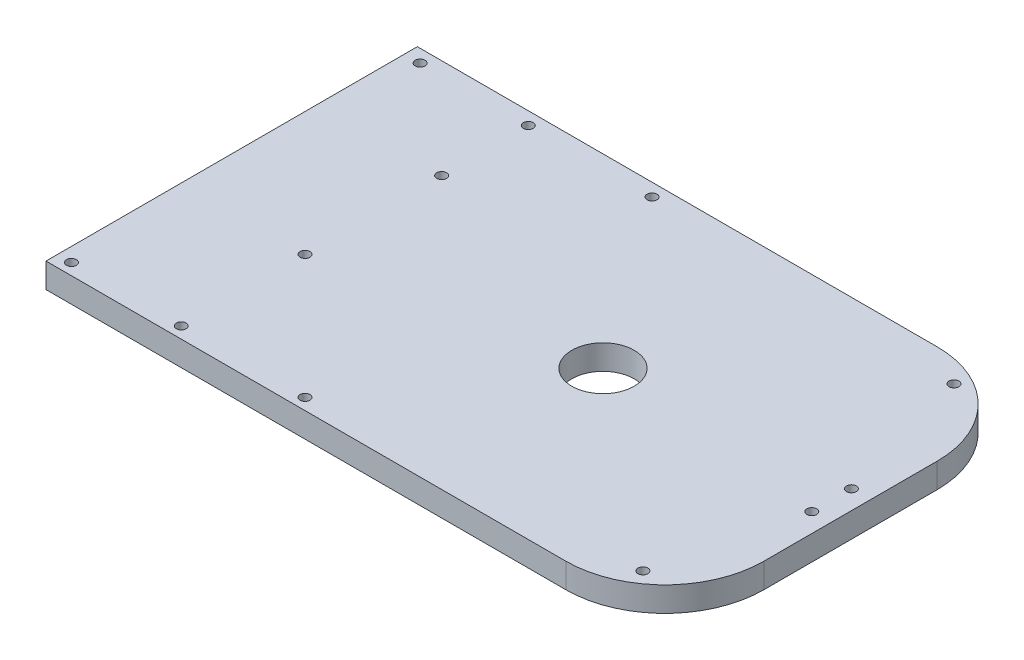
ISO-10303-21;
HEADER;
FILE_DESCRIPTION(('STEP AP214'),'2;1');
FILE_NAME('part.step','',(''),(''),'','','');
FILE_SCHEMA(('AUTOMOTIVE_DESIGN { 1 0 10303 214 1 1 1 1 }'));
ENDSEC;
DATA;
#1=APPLICATION_CONTEXT('core data for automotive mechanical design processes');
#2=APPLICATION_PROTOCOL_DEFINITION('international standard','automotive_design',2000,#1);
#3=PRODUCT_CONTEXT('',#1,'mechanical');
#4=PRODUCT('Part','Part','',(#3));
#5=PRODUCT_RELATED_PRODUCT_CATEGORY('part','',(#4));
#6=PRODUCT_DEFINITION_FORMATION('','',#4);
#7=PRODUCT_DEFINITION_CONTEXT('part definition',#1,'design');
#8=PRODUCT_DEFINITION('design','',#6,#7);
#9=PRODUCT_DEFINITION_SHAPE('','',#8);
#10=(LENGTH_UNIT() NAMED_UNIT(*) SI_UNIT(.MILLI.,.METRE.));
#11=(NAMED_UNIT(*) PLANE_ANGLE_UNIT() SI_UNIT($,.RADIAN.));
#12=(NAMED_UNIT(*) SI_UNIT($,.STERADIAN.) SOLID_ANGLE_UNIT());
#13=UNCERTAINTY_MEASURE_WITH_UNIT(LENGTH_MEASURE(1.E-05),#10,'distance_accuracy_value','');
#14=(GEOMETRIC_REPRESENTATION_CONTEXT(3) GLOBAL_UNCERTAINTY_ASSIGNED_CONTEXT((#13)) GLOBAL_UNIT_ASSIGNED_CONTEXT((#10,
#11,#12)) REPRESENTATION_CONTEXT('',''));
#15=CARTESIAN_POINT('',(0.,0.,0.));
#16=DIRECTION('',(0.,0.,1.));
#17=DIRECTION('',(1.,0.,0.));
#18=AXIS2_PLACEMENT_3D('',#15,#16,#17);
#19=CARTESIAN_POINT('',(0.,10.,0.));
#20=DIRECTION('',(1.,0.,0.));
#21=DIRECTION('',(0.,0.,-1.));
#22=AXIS2_PLACEMENT_3D('',#19,#20,#21);
#23=PLANE('',#22);
#24=DIRECTION('',(0.,0.,1.));
#25=VECTOR('',#24,1.);
#26=CARTESIAN_POINT('',(0.,0.,0.));
#27=LINE('',#26,#25);
#28=CARTESIAN_POINT('',(0.,0.,-150.));
#29=VERTEX_POINT('',#28);
#30=CARTESIAN_POINT('',(0.,0.,0.));
#31=VERTEX_POINT('',#30);
#32=EDGE_CURVE('E133',#29,#31,#27,.T.);
#33=ORIENTED_EDGE('',*,*,#32,.T.);
#34=DIRECTION('',(0.,-1.,0.));
#35=VECTOR('',#34,1.);
#36=CARTESIAN_POINT('',(0.,10.,0.));
#37=LINE('',#36,#35);
#38=CARTESIAN_POINT('',(0.,10.,0.));
#39=VERTEX_POINT('',#38);
#40=EDGE_CURVE('E11',#39,#31,#37,.T.);
#41=ORIENTED_EDGE('',*,*,#40,.F.);
#42=DIRECTION('',(0.,0.,1.));
#43=VECTOR('',#42,1.);
#44=CARTESIAN_POINT('',(0.,10.,0.));
#45=LINE('',#44,#43);
#46=CARTESIAN_POINT('',(0.,10.,-150.));
#47=VERTEX_POINT('',#46);
#48=EDGE_CURVE('E150',#47,#39,#45,.T.);
#49=ORIENTED_EDGE('',*,*,#48,.F.);
#50=DIRECTION('',(0.,-1.,0.));
#51=VECTOR('',#50,1.);
#52=CARTESIAN_POINT('',(0.,10.,-150.));
#53=LINE('',#52,#51);
#54=EDGE_CURVE('E129',#47,#29,#53,.T.);
#55=ORIENTED_EDGE('',*,*,#54,.T.);
#56=EDGE_LOOP('',(#33,#41,#49,#55));
#57=FACE_BOUND('',#56,.T.);
#58=ADVANCED_FACE('F44',(#57),#23,.F.);
#59=CARTESIAN_POINT('',(0.,10.,0.));
#60=DIRECTION('',(0.,0.,-1.));
#61=DIRECTION('',(-1.,0.,0.));
#62=AXIS2_PLACEMENT_3D('',#59,#60,#61);
#63=PLANE('',#62);
#64=DIRECTION('',(1.,0.,0.));
#65=VECTOR('',#64,1.);
#66=CARTESIAN_POINT('',(0.,0.,0.));
#67=LINE('',#66,#65);
#68=CARTESIAN_POINT('',(210.,0.,0.));
#69=VERTEX_POINT('',#68);
#70=EDGE_CURVE('E137',#31,#69,#67,.T.);
#71=ORIENTED_EDGE('',*,*,#70,.T.);
#72=DIRECTION('',(0.,-1.,0.));
#73=VECTOR('',#72,1.);
#74=CARTESIAN_POINT('',(210.,10.,0.));
#75=LINE('',#74,#73);
#76=CARTESIAN_POINT('',(210.,10.,0.));
#77=VERTEX_POINT('',#76);
#78=EDGE_CURVE('E53',#77,#69,#75,.T.);
#79=ORIENTED_EDGE('',*,*,#78,.F.);
#80=DIRECTION('',(1.,0.,0.));
#81=VECTOR('',#80,1.);
#82=CARTESIAN_POINT('',(0.,10.,0.));
#83=LINE('',#82,#81);
#84=EDGE_CURVE('E98',#39,#77,#83,.T.);
#85=ORIENTED_EDGE('',*,*,#84,.F.);
#86=ORIENTED_EDGE('',*,*,#40,.T.);
#87=EDGE_LOOP('',(#71,#79,#85,#86));
#88=FACE_BOUND('',#87,.T.);
#89=ADVANCED_FACE('F180',(#88),#63,.F.);
#90=CARTESIAN_POINT('',(210.,10.,-40.));
#91=DIRECTION('',(0.,-1.,0.));
#92=DIRECTION('',(0.,0.,-1.));
#93=AXIS2_PLACEMENT_3D('',#90,#91,#92);
#94=CYLINDRICAL_SURFACE('',#93,40.);
#95=CARTESIAN_POINT('',(210.,0.,-40.));
#96=DIRECTION('',(0.,1.,0.));
#97=DIRECTION('',(0.,0.,1.));
#98=AXIS2_PLACEMENT_3D('',#95,#96,#97);
#99=CIRCLE('',#98,40.);
#100=CARTESIAN_POINT('',(250.,0.,-40.0000000000003));
#101=VERTEX_POINT('',#100);
#102=EDGE_CURVE('E141',#69,#101,#99,.T.);
#103=ORIENTED_EDGE('',*,*,#102,.T.);
#104=DIRECTION('',(0.,-1.,0.));
#105=VECTOR('',#104,1.);
#106=CARTESIAN_POINT('',(250.,10.,-40.0000000000003));
#107=LINE('',#106,#105);
#108=CARTESIAN_POINT('',(250.,10.,-40.0000000000003));
#109=VERTEX_POINT('',#108);
#110=EDGE_CURVE('E122',#109,#101,#107,.T.);
#111=ORIENTED_EDGE('',*,*,#110,.F.);
#112=CARTESIAN_POINT('',(210.,10.,-40.));
#113=DIRECTION('',(0.,1.,0.));
#114=DIRECTION('',(0.,0.,1.));
#115=AXIS2_PLACEMENT_3D('',#112,#113,#114);
#116=CIRCLE('',#115,40.);
#117=EDGE_CURVE('E111',#77,#109,#116,.T.);
#118=ORIENTED_EDGE('',*,*,#117,.F.);
#119=ORIENTED_EDGE('',*,*,#78,.T.);
#120=EDGE_LOOP('',(#103,#111,#118,#119));
#121=FACE_BOUND('',#120,.T.);
#122=ADVANCED_FACE('F160',(#121),#94,.T.);
#123=CARTESIAN_POINT('',(250.,10.,-40.0000000000003));
#124=DIRECTION('',(-1.,0.,0.));
#125=DIRECTION('',(0.,0.,1.));
#126=AXIS2_PLACEMENT_3D('',#123,#124,#125);
#127=PLANE('',#126);
#128=DIRECTION('',(0.,0.,-1.));
#129=VECTOR('',#128,1.);
#130=CARTESIAN_POINT('',(250.,0.,-40.0000000000003));
#131=LINE('',#130,#129);
#132=CARTESIAN_POINT('',(250.,0.,-110.));
#133=VERTEX_POINT('',#132);
#134=EDGE_CURVE('E120',#101,#133,#131,.T.);
#135=ORIENTED_EDGE('',*,*,#134,.T.);
#136=DIRECTION('',(0.,-1.,0.));
#137=VECTOR('',#136,1.);
#138=CARTESIAN_POINT('',(250.,10.,-110.));
#139=LINE('',#138,#137);
#140=CARTESIAN_POINT('',(250.,10.,-110.));
#141=VERTEX_POINT('',#140);
#142=EDGE_CURVE('E117',#141,#133,#139,.T.);
#143=ORIENTED_EDGE('',*,*,#142,.F.);
#144=DIRECTION('',(0.,0.,-1.));
#145=VECTOR('',#144,1.);
#146=CARTESIAN_POINT('',(250.,10.,-40.0000000000003));
#147=LINE('',#146,#145);
#148=EDGE_CURVE('E105',#109,#141,#147,.T.);
#149=ORIENTED_EDGE('',*,*,#148,.F.);
#150=ORIENTED_EDGE('',*,*,#110,.T.);
#151=EDGE_LOOP('',(#135,#143,#149,#150));
#152=FACE_BOUND('',#151,.T.);
#153=ADVANCED_FACE('F118',(#152),#127,.F.);
#154=CARTESIAN_POINT('',(210.,10.,-110.));
#155=DIRECTION('',(0.,-1.,0.));
#156=DIRECTION('',(0.,0.,-1.));
#157=AXIS2_PLACEMENT_3D('',#154,#155,#156);
#158=CYLINDRICAL_SURFACE('',#157,40.);
#159=CARTESIAN_POINT('',(210.,0.,-110.));
#160=DIRECTION('',(0.,1.,0.));
#161=DIRECTION('',(0.,0.,1.));
#162=AXIS2_PLACEMENT_3D('',#159,#160,#161);
#163=CIRCLE('',#162,40.);
#164=CARTESIAN_POINT('',(210.,0.,-150.));
#165=VERTEX_POINT('',#164);
#166=EDGE_CURVE('E84',#133,#165,#163,.T.);
#167=ORIENTED_EDGE('',*,*,#166,.T.);
#168=DIRECTION('',(0.,-1.,0.));
#169=VECTOR('',#168,1.);
#170=CARTESIAN_POINT('',(210.,10.,-150.));
#171=LINE('',#170,#169);
#172=CARTESIAN_POINT('',(210.,10.,-150.));
#173=VERTEX_POINT('',#172);
#174=EDGE_CURVE('E123',#173,#165,#171,.T.);
#175=ORIENTED_EDGE('',*,*,#174,.F.);
#176=CARTESIAN_POINT('',(210.,10.,-110.));
#177=DIRECTION('',(0.,1.,0.));
#178=DIRECTION('',(0.,0.,1.));
#179=AXIS2_PLACEMENT_3D('',#176,#177,#178);
#180=CIRCLE('',#179,40.);
#181=EDGE_CURVE('E109',#141,#173,#180,.T.);
#182=ORIENTED_EDGE('',*,*,#181,.F.);
#183=ORIENTED_EDGE('',*,*,#142,.T.);
#184=EDGE_LOOP('',(#167,#175,#182,#183));
#185=FACE_BOUND('',#184,.T.);
#186=ADVANCED_FACE('F125',(#185),#158,.T.);
#187=CARTESIAN_POINT('',(0.,10.,-150.));
#188=DIRECTION('',(0.,0.,1.));
#189=DIRECTION('',(1.,0.,0.));
#190=AXIS2_PLACEMENT_3D('',#187,#188,#189);
#191=PLANE('',#190);
#192=DIRECTION('',(-1.,0.,0.));
#193=VECTOR('',#192,1.);
#194=CARTESIAN_POINT('',(0.,0.,-150.));
#195=LINE('',#194,#193);
#196=EDGE_CURVE('E90',#165,#29,#195,.T.);
#197=ORIENTED_EDGE('',*,*,#196,.T.);
#198=ORIENTED_EDGE('',*,*,#54,.F.);
#199=DIRECTION('',(-1.,0.,0.));
#200=VECTOR('',#199,1.);
#201=CARTESIAN_POINT('',(0.,10.,-150.));
#202=LINE('',#201,#200);
#203=EDGE_CURVE('E61',#173,#47,#202,.T.);
#204=ORIENTED_EDGE('',*,*,#203,.F.);
#205=ORIENTED_EDGE('',*,*,#174,.T.);
#206=EDGE_LOOP('',(#197,#198,#204,#205));
#207=FACE_BOUND('',#206,.T.);
#208=ADVANCED_FACE('F167',(#207),#191,.F.);
#209=CARTESIAN_POINT('',(210.,10.,-110.));
#210=DIRECTION('',(0.,1.,0.));
#211=DIRECTION('',(0.,0.,1.));
#212=AXIS2_PLACEMENT_3D('',#209,#210,#211);
#213=PLANE('',#212);
#214=CARTESIAN_POINT('',(242.34,10.,-83.));
#215=DIRECTION('',(0.,1.,0.));
#216=DIRECTION('',(0.,0.,1.));
#217=AXIS2_PLACEMENT_3D('',#214,#215,#216);
#218=CIRCLE('',#217,2.);
#219=CARTESIAN_POINT('',(242.34,10.,-81.));
#220=VERTEX_POINT('',#219);
#221=EDGE_CURVE('E411',#220,#220,#218,.T.);
#222=ORIENTED_EDGE('',*,*,#221,.F.);
#223=EDGE_LOOP('',(#222));
#224=FACE_BOUND('',#223,.T.);
#225=CARTESIAN_POINT('',(242.34,10.,-67.));
#226=DIRECTION('',(0.,1.,0.));
#227=DIRECTION('',(0.,0.,1.));
#228=AXIS2_PLACEMENT_3D('',#225,#226,#227);
#229=CIRCLE('',#228,2.);
#230=CARTESIAN_POINT('',(242.34,10.,-65.));
#231=VERTEX_POINT('',#230);
#232=EDGE_CURVE('E413',#231,#231,#229,.T.);
#233=ORIENTED_EDGE('',*,*,#232,.F.);
#234=EDGE_LOOP('',(#233));
#235=FACE_BOUND('',#234,.T.);
#236=CARTESIAN_POINT('',(50.,10.,-4.63));
#237=DIRECTION('',(0.,1.,0.));
#238=DIRECTION('',(0.,0.,1.));
#239=AXIS2_PLACEMENT_3D('',#236,#237,#238);
#240=CIRCLE('',#239,2.);
#241=CARTESIAN_POINT('',(50.,10.,-2.63));
#242=VERTEX_POINT('',#241);
#243=EDGE_CURVE('E434',#242,#242,#240,.T.);
#244=ORIENTED_EDGE('',*,*,#243,.F.);
#245=EDGE_LOOP('',(#244));
#246=FACE_BOUND('',#245,.T.);
#247=CARTESIAN_POINT('',(100.,10.,-4.63));
#248=DIRECTION('',(0.,1.,0.));
#249=DIRECTION('',(0.,0.,1.));
#250=AXIS2_PLACEMENT_3D('',#247,#248,#249);
#251=CIRCLE('',#250,2.);
#252=CARTESIAN_POINT('',(100.,10.,-2.63));
#253=VERTEX_POINT('',#252);
#254=EDGE_CURVE('E443',#253,#253,#251,.T.);
#255=ORIENTED_EDGE('',*,*,#254,.F.);
#256=EDGE_LOOP('',(#255));
#257=FACE_BOUND('',#256,.T.);
#258=CARTESIAN_POINT('',(100.,10.,-144.82));
#259=DIRECTION('',(0.,1.,0.));
#260=DIRECTION('',(0.,0.,1.));
#261=AXIS2_PLACEMENT_3D('',#258,#259,#260);
#262=CIRCLE('',#261,2.);
#263=CARTESIAN_POINT('',(100.,10.,-142.82));
#264=VERTEX_POINT('',#263);
#265=EDGE_CURVE('E451',#264,#264,#262,.T.);
#266=ORIENTED_EDGE('',*,*,#265,.F.);
#267=EDGE_LOOP('',(#266));
#268=FACE_BOUND('',#267,.T.);
#269=CARTESIAN_POINT('',(50.,10.,-109.82));
#270=DIRECTION('',(0.,1.,0.));
#271=DIRECTION('',(0.,0.,1.));
#272=AXIS2_PLACEMENT_3D('',#269,#270,#271);
#273=CIRCLE('',#272,2.);
#274=CARTESIAN_POINT('',(50.,10.,-107.82));
#275=VERTEX_POINT('',#274);
#276=EDGE_CURVE('E459',#275,#275,#273,.T.);
#277=ORIENTED_EDGE('',*,*,#276,.F.);
#278=EDGE_LOOP('',(#277));
#279=FACE_BOUND('',#278,.T.);
#280=CARTESIAN_POINT('',(50.,10.,-54.63));
#281=DIRECTION('',(0.,1.,0.));
#282=DIRECTION('',(0.,0.,1.));
#283=AXIS2_PLACEMENT_3D('',#280,#281,#282);
#284=CIRCLE('',#283,2.);
#285=CARTESIAN_POINT('',(50.,10.,-52.63));
#286=VERTEX_POINT('',#285);
#287=EDGE_CURVE('E426',#286,#286,#284,.T.);
#288=ORIENTED_EDGE('',*,*,#287,.F.);
#289=EDGE_LOOP('',(#288));
#290=FACE_BOUND('',#289,.T.);
#291=CARTESIAN_POINT('',(50.,10.,-144.82));
#292=DIRECTION('',(0.,1.,0.));
#293=DIRECTION('',(0.,0.,1.));
#294=AXIS2_PLACEMENT_3D('',#291,#292,#293);
#295=CIRCLE('',#294,2.);
#296=CARTESIAN_POINT('',(50.,10.,-142.82));
#297=VERTEX_POINT('',#296);
#298=EDGE_CURVE('E438',#297,#297,#295,.T.);
#299=ORIENTED_EDGE('',*,*,#298,.F.);
#300=EDGE_LOOP('',(#299));
#301=FACE_BOUND('',#300,.T.);
#302=CARTESIAN_POINT('',(228.949949787565,10.,-12.1645825910987));
#303=DIRECTION('',(0.,1.,0.));
#304=DIRECTION('',(0.,0.,1.));
#305=AXIS2_PLACEMENT_3D('',#302,#303,#304);
#306=CIRCLE('',#305,2.);
#307=CARTESIAN_POINT('',(228.949949787565,10.,-10.1645825910987));
#308=VERTEX_POINT('',#307);
#309=EDGE_CURVE('E470',#308,#308,#306,.T.);
#310=ORIENTED_EDGE('',*,*,#309,.F.);
#311=EDGE_LOOP('',(#310));
#312=FACE_BOUND('',#311,.T.);
#313=CARTESIAN_POINT('',(226.364130141109,10.,-140.421237055358));
#314=DIRECTION('',(0.,1.,0.));
#315=DIRECTION('',(0.,0.,1.));
#316=AXIS2_PLACEMENT_3D('',#313,#314,#315);
#317=CIRCLE('',#316,2.);
#318=CARTESIAN_POINT('',(226.364130141109,10.,-138.421237055358));
#319=VERTEX_POINT('',#318);
#320=EDGE_CURVE('E478',#319,#319,#317,.T.);
#321=ORIENTED_EDGE('',*,*,#320,.F.);
#322=EDGE_LOOP('',(#321));
#323=FACE_BOUND('',#322,.T.);
#324=CARTESIAN_POINT('',(5.63572035741244,10.,-4.63282920356067));
#325=DIRECTION('',(0.,1.,0.));
#326=DIRECTION('',(0.,0.,1.));
#327=AXIS2_PLACEMENT_3D('',#324,#325,#326);
#328=CIRCLE('',#327,2.);
#329=CARTESIAN_POINT('',(5.63572035741244,10.,-2.63282920356067));
#330=VERTEX_POINT('',#329);
#331=EDGE_CURVE('E486',#330,#330,#328,.T.);
#332=ORIENTED_EDGE('',*,*,#331,.F.);
#333=EDGE_LOOP('',(#332));
#334=FACE_BOUND('',#333,.T.);
#335=CARTESIAN_POINT('',(6.31087822763052,10.,-144.817130454335));
#336=DIRECTION('',(0.,1.,0.));
#337=DIRECTION('',(0.,0.,1.));
#338=AXIS2_PLACEMENT_3D('',#335,#336,#337);
#339=CIRCLE('',#338,2.);
#340=CARTESIAN_POINT('',(6.31087822763052,10.,-142.817130454335));
#341=VERTEX_POINT('',#340);
#342=EDGE_CURVE('E494',#341,#341,#339,.T.);
#343=ORIENTED_EDGE('',*,*,#342,.F.);
#344=EDGE_LOOP('',(#343));
#345=FACE_BOUND('',#344,.T.);
#346=CARTESIAN_POINT('',(150.,10.,-75.));
#347=DIRECTION('',(0.,-1.,0.));
#348=DIRECTION('',(0.,0.,-1.));
#349=AXIS2_PLACEMENT_3D('',#346,#347,#348);
#350=CIRCLE('',#349,12.59794853);
#351=CARTESIAN_POINT('',(150.,10.,-87.59794853));
#352=VERTEX_POINT('',#351);
#353=EDGE_CURVE('E138',#352,#352,#350,.T.);
#354=ORIENTED_EDGE('',*,*,#353,.T.);
#355=EDGE_LOOP('',(#354));
#356=FACE_BOUND('',#355,.T.);
#357=ORIENTED_EDGE('',*,*,#48,.T.);
#358=ORIENTED_EDGE('',*,*,#84,.T.);
#359=ORIENTED_EDGE('',*,*,#117,.T.);
#360=ORIENTED_EDGE('',*,*,#148,.T.);
#361=ORIENTED_EDGE('',*,*,#181,.T.);
#362=ORIENTED_EDGE('',*,*,#203,.T.);
#363=EDGE_LOOP('',(#357,#358,#359,#360,#361,#362));
#364=FACE_BOUND('',#363,.T.);
#365=ADVANCED_FACE('F107',(#224,#235,#246,#257,#268,#279,#290,#301,#312,#323,#334,#345,#356,
#364),#213,.T.);
#366=CARTESIAN_POINT('',(210.,0.,-110.));
#367=DIRECTION('',(0.,1.,0.));
#368=DIRECTION('',(0.,0.,1.));
#369=AXIS2_PLACEMENT_3D('',#366,#367,#368);
#370=PLANE('',#369);
#371=CARTESIAN_POINT('',(242.34,0.,-83.));
#372=DIRECTION('',(0.,1.,0.));
#373=DIRECTION('',(0.,0.,1.));
#374=AXIS2_PLACEMENT_3D('',#371,#372,#373);
#375=CIRCLE('',#374,2.);
#376=CARTESIAN_POINT('',(242.34,0.,-81.));
#377=VERTEX_POINT('',#376);
#378=EDGE_CURVE('E408',#377,#377,#375,.T.);
#379=ORIENTED_EDGE('',*,*,#378,.T.);
#380=EDGE_LOOP('',(#379));
#381=FACE_BOUND('',#380,.T.);
#382=CARTESIAN_POINT('',(242.34,0.,-67.));
#383=DIRECTION('',(0.,1.,0.));
#384=DIRECTION('',(0.,0.,1.));
#385=AXIS2_PLACEMENT_3D('',#382,#383,#384);
#386=CIRCLE('',#385,2.);
#387=CARTESIAN_POINT('',(242.34,0.,-65.));
#388=VERTEX_POINT('',#387);
#389=EDGE_CURVE('E420',#388,#388,#386,.T.);
#390=ORIENTED_EDGE('',*,*,#389,.T.);
#391=EDGE_LOOP('',(#390));
#392=FACE_BOUND('',#391,.T.);
#393=CARTESIAN_POINT('',(50.,0.,-4.63));
#394=DIRECTION('',(0.,1.,0.));
#395=DIRECTION('',(0.,0.,1.));
#396=AXIS2_PLACEMENT_3D('',#393,#394,#395);
#397=CIRCLE('',#396,2.);
#398=CARTESIAN_POINT('',(50.,0.,-2.63));
#399=VERTEX_POINT('',#398);
#400=EDGE_CURVE('E439',#399,#399,#397,.T.);
#401=ORIENTED_EDGE('',*,*,#400,.T.);
#402=EDGE_LOOP('',(#401));
#403=FACE_BOUND('',#402,.T.);
#404=CARTESIAN_POINT('',(100.,0.,-4.63));
#405=DIRECTION('',(0.,1.,0.));
#406=DIRECTION('',(0.,0.,1.));
#407=AXIS2_PLACEMENT_3D('',#404,#405,#406);
#408=CIRCLE('',#407,2.);
#409=CARTESIAN_POINT('',(100.,0.,-2.63));
#410=VERTEX_POINT('',#409);
#411=EDGE_CURVE('E447',#410,#410,#408,.T.);
#412=ORIENTED_EDGE('',*,*,#411,.T.);
#413=EDGE_LOOP('',(#412));
#414=FACE_BOUND('',#413,.T.);
#415=CARTESIAN_POINT('',(100.,0.,-144.82));
#416=DIRECTION('',(0.,1.,0.));
#417=DIRECTION('',(0.,0.,1.));
#418=AXIS2_PLACEMENT_3D('',#415,#416,#417);
#419=CIRCLE('',#418,2.);
#420=CARTESIAN_POINT('',(100.,0.,-142.82));
#421=VERTEX_POINT('',#420);
#422=EDGE_CURVE('E455',#421,#421,#419,.T.);
#423=ORIENTED_EDGE('',*,*,#422,.T.);
#424=EDGE_LOOP('',(#423));
#425=FACE_BOUND('',#424,.T.);
#426=CARTESIAN_POINT('',(50.,0.,-109.82));
#427=DIRECTION('',(0.,1.,0.));
#428=DIRECTION('',(0.,0.,1.));
#429=AXIS2_PLACEMENT_3D('',#426,#427,#428);
#430=CIRCLE('',#429,2.);
#431=CARTESIAN_POINT('',(50.,0.,-107.82));
#432=VERTEX_POINT('',#431);
#433=EDGE_CURVE('E430',#432,#432,#430,.T.);
#434=ORIENTED_EDGE('',*,*,#433,.T.);
#435=EDGE_LOOP('',(#434));
#436=FACE_BOUND('',#435,.T.);
#437=CARTESIAN_POINT('',(50.,0.,-54.63));
#438=DIRECTION('',(0.,1.,0.));
#439=DIRECTION('',(0.,0.,1.));
#440=AXIS2_PLACEMENT_3D('',#437,#438,#439);
#441=CIRCLE('',#440,2.);
#442=CARTESIAN_POINT('',(50.,0.,-52.63));
#443=VERTEX_POINT('',#442);
#444=EDGE_CURVE('E417',#443,#443,#441,.T.);
#445=ORIENTED_EDGE('',*,*,#444,.T.);
#446=EDGE_LOOP('',(#445));
#447=FACE_BOUND('',#446,.T.);
#448=CARTESIAN_POINT('',(50.,0.,-144.82));
#449=DIRECTION('',(0.,1.,0.));
#450=DIRECTION('',(0.,0.,1.));
#451=AXIS2_PLACEMENT_3D('',#448,#449,#450);
#452=CIRCLE('',#451,2.);
#453=CARTESIAN_POINT('',(50.,0.,-142.82));
#454=VERTEX_POINT('',#453);
#455=EDGE_CURVE('E466',#454,#454,#452,.T.);
#456=ORIENTED_EDGE('',*,*,#455,.T.);
#457=EDGE_LOOP('',(#456));
#458=FACE_BOUND('',#457,.T.);
#459=CARTESIAN_POINT('',(228.949949787565,0.,-12.1645825910987));
#460=DIRECTION('',(0.,1.,0.));
#461=DIRECTION('',(0.,0.,1.));
#462=AXIS2_PLACEMENT_3D('',#459,#460,#461);
#463=CIRCLE('',#462,2.);
#464=CARTESIAN_POINT('',(228.949949787565,0.,-10.1645825910987));
#465=VERTEX_POINT('',#464);
#466=EDGE_CURVE('E474',#465,#465,#463,.T.);
#467=ORIENTED_EDGE('',*,*,#466,.T.);
#468=EDGE_LOOP('',(#467));
#469=FACE_BOUND('',#468,.T.);
#470=CARTESIAN_POINT('',(226.364130141109,0.,-140.421237055358));
#471=DIRECTION('',(0.,1.,0.));
#472=DIRECTION('',(0.,0.,1.));
#473=AXIS2_PLACEMENT_3D('',#470,#471,#472);
#474=CIRCLE('',#473,2.);
#475=CARTESIAN_POINT('',(226.364130141109,0.,-138.421237055358));
#476=VERTEX_POINT('',#475);
#477=EDGE_CURVE('E482',#476,#476,#474,.T.);
#478=ORIENTED_EDGE('',*,*,#477,.T.);
#479=EDGE_LOOP('',(#478));
#480=FACE_BOUND('',#479,.T.);
#481=CARTESIAN_POINT('',(5.63572035741244,0.,-4.63282920356067));
#482=DIRECTION('',(0.,1.,0.));
#483=DIRECTION('',(0.,0.,1.));
#484=AXIS2_PLACEMENT_3D('',#481,#482,#483);
#485=CIRCLE('',#484,2.);
#486=CARTESIAN_POINT('',(5.63572035741244,0.,-2.63282920356067));
#487=VERTEX_POINT('',#486);
#488=EDGE_CURVE('E490',#487,#487,#485,.T.);
#489=ORIENTED_EDGE('',*,*,#488,.T.);
#490=EDGE_LOOP('',(#489));
#491=FACE_BOUND('',#490,.T.);
#492=CARTESIAN_POINT('',(6.31087822763052,0.,-144.817130454335));
#493=DIRECTION('',(0.,1.,0.));
#494=DIRECTION('',(0.,0.,1.));
#495=AXIS2_PLACEMENT_3D('',#492,#493,#494);
#496=CIRCLE('',#495,2.);
#497=CARTESIAN_POINT('',(6.31087822763052,0.,-142.817130454335));
#498=VERTEX_POINT('',#497);
#499=EDGE_CURVE('E498',#498,#498,#496,.T.);
#500=ORIENTED_EDGE('',*,*,#499,.T.);
#501=EDGE_LOOP('',(#500));
#502=FACE_BOUND('',#501,.T.);
#503=CARTESIAN_POINT('',(150.,0.,-75.));
#504=DIRECTION('',(0.,-1.,0.));
#505=DIRECTION('',(0.,0.,-1.));
#506=AXIS2_PLACEMENT_3D('',#503,#504,#505);
#507=CIRCLE('',#506,12.59794853);
#508=CARTESIAN_POINT('',(150.,0.,-87.59794853));
#509=VERTEX_POINT('',#508);
#510=EDGE_CURVE('E502',#509,#509,#507,.T.);
#511=ORIENTED_EDGE('',*,*,#510,.F.);
#512=EDGE_LOOP('',(#511));
#513=FACE_BOUND('',#512,.T.);
#514=ORIENTED_EDGE('',*,*,#32,.F.);
#515=ORIENTED_EDGE('',*,*,#196,.F.);
#516=ORIENTED_EDGE('',*,*,#166,.F.);
#517=ORIENTED_EDGE('',*,*,#134,.F.);
#518=ORIENTED_EDGE('',*,*,#102,.F.);
#519=ORIENTED_EDGE('',*,*,#70,.F.);
#520=EDGE_LOOP('',(#514,#515,#516,#517,#518,#519));
#521=FACE_BOUND('',#520,.T.);
#522=ADVANCED_FACE('F163',(#381,#392,#403,#414,#425,#436,#447,#458,#469,#480,#491,#502,#513,
#521),#370,.F.);
#523=CARTESIAN_POINT('',(150.,10.,-75.));
#524=DIRECTION('',(0.,-1.,0.));
#525=DIRECTION('',(0.,0.,-1.));
#526=AXIS2_PLACEMENT_3D('',#523,#524,#525);
#527=CYLINDRICAL_SURFACE('',#526,12.59794853);
#528=ORIENTED_EDGE('',*,*,#353,.F.);
#529=EDGE_LOOP('',(#528));
#530=FACE_BOUND('',#529,.T.);
#531=ORIENTED_EDGE('',*,*,#510,.T.);
#532=EDGE_LOOP('',(#531));
#533=FACE_BOUND('',#532,.T.);
#534=ADVANCED_FACE('F210',(#530,#533),#527,.F.);
#535=CARTESIAN_POINT('',(6.31087822763052,0.,-144.817130454335));
#536=DIRECTION('',(0.,1.,0.));
#537=DIRECTION('',(0.,0.,1.));
#538=AXIS2_PLACEMENT_3D('',#535,#536,#537);
#539=CYLINDRICAL_SURFACE('',#538,2.);
#540=ORIENTED_EDGE('',*,*,#499,.F.);
#541=EDGE_LOOP('',(#540));
#542=FACE_BOUND('',#541,.T.);
#543=ORIENTED_EDGE('',*,*,#342,.T.);
#544=EDGE_LOOP('',(#543));
#545=FACE_BOUND('',#544,.T.);
#546=ADVANCED_FACE('F215',(#542,#545),#539,.F.);
#547=CARTESIAN_POINT('',(5.63572035741244,0.,-4.63282920356067));
#548=DIRECTION('',(0.,1.,0.));
#549=DIRECTION('',(0.,0.,1.));
#550=AXIS2_PLACEMENT_3D('',#547,#548,#549);
#551=CYLINDRICAL_SURFACE('',#550,2.);
#552=ORIENTED_EDGE('',*,*,#488,.F.);
#553=EDGE_LOOP('',(#552));
#554=FACE_BOUND('',#553,.T.);
#555=ORIENTED_EDGE('',*,*,#331,.T.);
#556=EDGE_LOOP('',(#555));
#557=FACE_BOUND('',#556,.T.);
#558=ADVANCED_FACE('F228',(#554,#557),#551,.F.);
#559=CARTESIAN_POINT('',(226.364130141109,0.,-140.421237055358));
#560=DIRECTION('',(0.,1.,0.));
#561=DIRECTION('',(0.,0.,1.));
#562=AXIS2_PLACEMENT_3D('',#559,#560,#561);
#563=CYLINDRICAL_SURFACE('',#562,2.);
#564=ORIENTED_EDGE('',*,*,#477,.F.);
#565=EDGE_LOOP('',(#564));
#566=FACE_BOUND('',#565,.T.);
#567=ORIENTED_EDGE('',*,*,#320,.T.);
#568=EDGE_LOOP('',(#567));
#569=FACE_BOUND('',#568,.T.);
#570=ADVANCED_FACE('F239',(#566,#569),#563,.F.);
#571=CARTESIAN_POINT('',(228.949949787565,0.,-12.1645825910987));
#572=DIRECTION('',(0.,1.,0.));
#573=DIRECTION('',(0.,0.,1.));
#574=AXIS2_PLACEMENT_3D('',#571,#572,#573);
#575=CYLINDRICAL_SURFACE('',#574,2.);
#576=ORIENTED_EDGE('',*,*,#466,.F.);
#577=EDGE_LOOP('',(#576));
#578=FACE_BOUND('',#577,.T.);
#579=ORIENTED_EDGE('',*,*,#309,.T.);
#580=EDGE_LOOP('',(#579));
#581=FACE_BOUND('',#580,.T.);
#582=ADVANCED_FACE('F250',(#578,#581),#575,.F.);
#583=CARTESIAN_POINT('',(50.,0.,-144.82));
#584=DIRECTION('',(0.,1.,0.));
#585=DIRECTION('',(0.,0.,1.));
#586=AXIS2_PLACEMENT_3D('',#583,#584,#585);
#587=CYLINDRICAL_SURFACE('',#586,2.);
#588=ORIENTED_EDGE('',*,*,#455,.F.);
#589=EDGE_LOOP('',(#588));
#590=FACE_BOUND('',#589,.T.);
#591=ORIENTED_EDGE('',*,*,#298,.T.);
#592=EDGE_LOOP('',(#591));
#593=FACE_BOUND('',#592,.T.);
#594=ADVANCED_FACE('F261',(#590,#593),#587,.F.);
#595=CARTESIAN_POINT('',(50.,0.,-54.63));
#596=DIRECTION('',(0.,1.,0.));
#597=DIRECTION('',(0.,0.,1.));
#598=AXIS2_PLACEMENT_3D('',#595,#596,#597);
#599=CYLINDRICAL_SURFACE('',#598,2.);
#600=ORIENTED_EDGE('',*,*,#444,.F.);
#601=EDGE_LOOP('',(#600));
#602=FACE_BOUND('',#601,.T.);
#603=ORIENTED_EDGE('',*,*,#287,.T.);
#604=EDGE_LOOP('',(#603));
#605=FACE_BOUND('',#604,.T.);
#606=ADVANCED_FACE('F272',(#602,#605),#599,.F.);
#607=CARTESIAN_POINT('',(50.,0.,-109.82));
#608=DIRECTION('',(0.,1.,0.));
#609=DIRECTION('',(0.,0.,1.));
#610=AXIS2_PLACEMENT_3D('',#607,#608,#609);
#611=CYLINDRICAL_SURFACE('',#610,2.);
#612=ORIENTED_EDGE('',*,*,#433,.F.);
#613=EDGE_LOOP('',(#612));
#614=FACE_BOUND('',#613,.T.);
#615=ORIENTED_EDGE('',*,*,#276,.T.);
#616=EDGE_LOOP('',(#615));
#617=FACE_BOUND('',#616,.T.);
#618=ADVANCED_FACE('F283',(#614,#617),#611,.F.);
#619=CARTESIAN_POINT('',(100.,0.,-144.82));
#620=DIRECTION('',(0.,1.,0.));
#621=DIRECTION('',(0.,0.,1.));
#622=AXIS2_PLACEMENT_3D('',#619,#620,#621);
#623=CYLINDRICAL_SURFACE('',#622,2.);
#624=ORIENTED_EDGE('',*,*,#422,.F.);
#625=EDGE_LOOP('',(#624));
#626=FACE_BOUND('',#625,.T.);
#627=ORIENTED_EDGE('',*,*,#265,.T.);
#628=EDGE_LOOP('',(#627));
#629=FACE_BOUND('',#628,.T.);
#630=ADVANCED_FACE('F294',(#626,#629),#623,.F.);
#631=CARTESIAN_POINT('',(100.,0.,-4.63));
#632=DIRECTION('',(0.,1.,0.));
#633=DIRECTION('',(0.,0.,1.));
#634=AXIS2_PLACEMENT_3D('',#631,#632,#633);
#635=CYLINDRICAL_SURFACE('',#634,2.);
#636=ORIENTED_EDGE('',*,*,#411,.F.);
#637=EDGE_LOOP('',(#636));
#638=FACE_BOUND('',#637,.T.);
#639=ORIENTED_EDGE('',*,*,#254,.T.);
#640=EDGE_LOOP('',(#639));
#641=FACE_BOUND('',#640,.T.);
#642=ADVANCED_FACE('F305',(#638,#641),#635,.F.);
#643=CARTESIAN_POINT('',(50.,0.,-4.63));
#644=DIRECTION('',(0.,1.,0.));
#645=DIRECTION('',(0.,0.,1.));
#646=AXIS2_PLACEMENT_3D('',#643,#644,#645);
#647=CYLINDRICAL_SURFACE('',#646,2.);
#648=ORIENTED_EDGE('',*,*,#400,.F.);
#649=EDGE_LOOP('',(#648));
#650=FACE_BOUND('',#649,.T.);
#651=ORIENTED_EDGE('',*,*,#243,.T.);
#652=EDGE_LOOP('',(#651));
#653=FACE_BOUND('',#652,.T.);
#654=ADVANCED_FACE('F316',(#650,#653),#647,.F.);
#655=CARTESIAN_POINT('',(242.34,0.,-67.));
#656=DIRECTION('',(0.,1.,0.));
#657=DIRECTION('',(0.,0.,1.));
#658=AXIS2_PLACEMENT_3D('',#655,#656,#657);
#659=CYLINDRICAL_SURFACE('',#658,2.);
#660=ORIENTED_EDGE('',*,*,#389,.F.);
#661=EDGE_LOOP('',(#660));
#662=FACE_BOUND('',#661,.T.);
#663=ORIENTED_EDGE('',*,*,#232,.T.);
#664=EDGE_LOOP('',(#663));
#665=FACE_BOUND('',#664,.T.);
#666=ADVANCED_FACE('F326',(#662,#665),#659,.F.);
#667=CARTESIAN_POINT('',(242.34,0.,-83.));
#668=DIRECTION('',(0.,1.,0.));
#669=DIRECTION('',(0.,0.,1.));
#670=AXIS2_PLACEMENT_3D('',#667,#668,#669);
#671=CYLINDRICAL_SURFACE('',#670,2.);
#672=ORIENTED_EDGE('',*,*,#378,.F.);
#673=EDGE_LOOP('',(#672));
#674=FACE_BOUND('',#673,.T.);
#675=ORIENTED_EDGE('',*,*,#221,.T.);
#676=EDGE_LOOP('',(#675));
#677=FACE_BOUND('',#676,.T.);
#678=ADVANCED_FACE('F344',(#674,#677),#671,.F.);
#679=CLOSED_SHELL('',(#58,#89,#122,#153,#186,#208,#365,#522,#534,#546,#558,#570,#582,#594,#606,
#618,#630,#642,#654,#666,#678));
#680=MANIFOLD_SOLID_BREP('B2',#679);
#681=ADVANCED_BREP_SHAPE_REPRESENTATION('',(#18,#680),#14);
#682=SHAPE_DEFINITION_REPRESENTATION(#9,#681);
ENDSEC;
END-ISO-10303-21;
